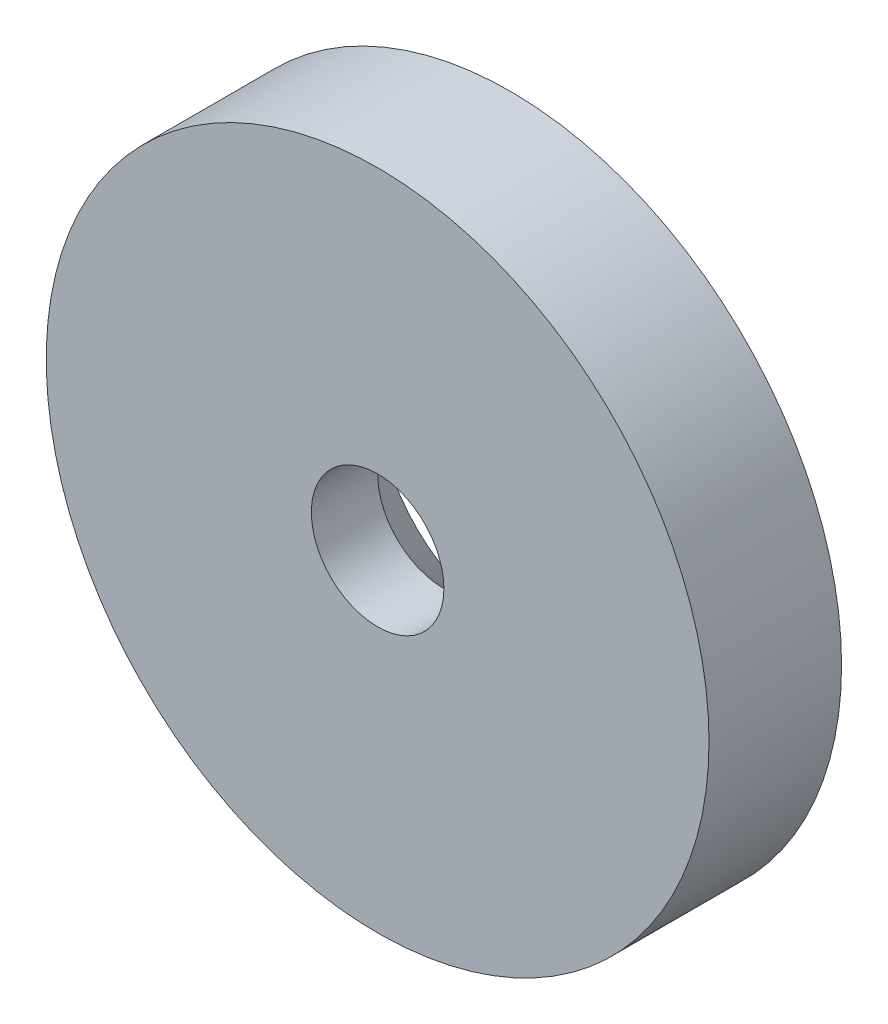
ISO-10303-21;
HEADER;
FILE_DESCRIPTION(('STEP AP214'),'2;1');
FILE_NAME('part.step','',(''),(''),'','','');
FILE_SCHEMA(('AUTOMOTIVE_DESIGN { 1 0 10303 214 1 1 1 1 }'));
ENDSEC;
DATA;
#1=APPLICATION_CONTEXT('core data for automotive mechanical design processes');
#2=APPLICATION_PROTOCOL_DEFINITION('international standard','automotive_design',2000,#1);
#3=PRODUCT_CONTEXT('',#1,'mechanical');
#4=PRODUCT('Part','Part','',(#3));
#5=PRODUCT_RELATED_PRODUCT_CATEGORY('part','',(#4));
#6=PRODUCT_DEFINITION_FORMATION('','',#4);
#7=PRODUCT_DEFINITION_CONTEXT('part definition',#1,'design');
#8=PRODUCT_DEFINITION('design','',#6,#7);
#9=PRODUCT_DEFINITION_SHAPE('','',#8);
#10=(LENGTH_UNIT() NAMED_UNIT(*) SI_UNIT(.MILLI.,.METRE.));
#11=(NAMED_UNIT(*) PLANE_ANGLE_UNIT() SI_UNIT($,.RADIAN.));
#12=(NAMED_UNIT(*) SI_UNIT($,.STERADIAN.) SOLID_ANGLE_UNIT());
#13=UNCERTAINTY_MEASURE_WITH_UNIT(LENGTH_MEASURE(1.E-05),#10,'distance_accuracy_value','');
#14=(GEOMETRIC_REPRESENTATION_CONTEXT(3) GLOBAL_UNCERTAINTY_ASSIGNED_CONTEXT((#13)) GLOBAL_UNIT_ASSIGNED_CONTEXT((#10,
#11,#12)) REPRESENTATION_CONTEXT('',''));
#15=CARTESIAN_POINT('',(0.,0.,0.));
#16=DIRECTION('',(0.,0.,1.));
#17=DIRECTION('',(1.,0.,0.));
#18=AXIS2_PLACEMENT_3D('',#15,#16,#17);
#19=CARTESIAN_POINT('',(0.,0.,4.));
#20=DIRECTION('',(0.,0.,-1.));
#21=DIRECTION('',(-1.,0.,0.));
#22=AXIS2_PLACEMENT_3D('',#19,#20,#21);
#23=CYLINDRICAL_SURFACE('',#22,10.);
#24=CARTESIAN_POINT('',(0.,0.,4.));
#25=DIRECTION('',(0.,0.,1.));
#26=DIRECTION('',(1.,0.,0.));
#27=AXIS2_PLACEMENT_3D('',#24,#25,#26);
#28=CIRCLE('',#27,10.);
#29=CARTESIAN_POINT('',(10.,0.,4.));
#30=VERTEX_POINT('',#29);
#31=EDGE_CURVE('E42',#30,#30,#28,.T.);
#32=ORIENTED_EDGE('',*,*,#31,.F.);
#33=EDGE_LOOP('',(#32));
#34=FACE_BOUND('',#33,.T.);
#35=CARTESIAN_POINT('',(0.,0.,0.));
#36=DIRECTION('',(0.,0.,1.));
#37=DIRECTION('',(1.,0.,0.));
#38=AXIS2_PLACEMENT_3D('',#35,#36,#37);
#39=CIRCLE('',#38,10.);
#40=CARTESIAN_POINT('',(10.,0.,0.));
#41=VERTEX_POINT('',#40);
#42=EDGE_CURVE('E46',#41,#41,#39,.T.);
#43=ORIENTED_EDGE('',*,*,#42,.T.);
#44=EDGE_LOOP('',(#43));
#45=FACE_BOUND('',#44,.T.);
#46=ADVANCED_FACE('F31',(#34,#45),#23,.T.);
#47=CARTESIAN_POINT('',(0.,0.,4.));
#48=DIRECTION('',(0.,0.,1.));
#49=DIRECTION('',(1.,0.,0.));
#50=AXIS2_PLACEMENT_3D('',#47,#48,#49);
#51=PLANE('',#50);
#52=CARTESIAN_POINT('',(0.,0.,4.));
#53=DIRECTION('',(0.,0.,1.));
#54=DIRECTION('',(1.,0.,0.));
#55=AXIS2_PLACEMENT_3D('',#52,#53,#54);
#56=CIRCLE('',#55,2.);
#57=CARTESIAN_POINT('',(2.,0.,4.));
#58=VERTEX_POINT('',#57);
#59=EDGE_CURVE('E50',#58,#58,#56,.T.);
#60=ORIENTED_EDGE('',*,*,#59,.F.);
#61=EDGE_LOOP('',(#60));
#62=FACE_BOUND('',#61,.T.);
#63=ORIENTED_EDGE('',*,*,#31,.T.);
#64=EDGE_LOOP('',(#63));
#65=FACE_BOUND('',#64,.T.);
#66=ADVANCED_FACE('F57',(#62,#65),#51,.T.);
#67=CARTESIAN_POINT('',(0.,0.,0.));
#68=DIRECTION('',(0.,0.,1.));
#69=DIRECTION('',(1.,0.,0.));
#70=AXIS2_PLACEMENT_3D('',#67,#68,#69);
#71=PLANE('',#70);
#72=CARTESIAN_POINT('',(0.,0.,0.));
#73=DIRECTION('',(0.,0.,1.));
#74=DIRECTION('',(1.,0.,0.));
#75=AXIS2_PLACEMENT_3D('',#72,#73,#74);
#76=CIRCLE('',#75,4.00000000000001);
#77=CARTESIAN_POINT('',(4.00000000000001,0.,0.));
#78=VERTEX_POINT('',#77);
#79=EDGE_CURVE('E38',#78,#78,#76,.T.);
#80=ORIENTED_EDGE('',*,*,#79,.T.);
#81=EDGE_LOOP('',(#80));
#82=FACE_BOUND('',#81,.T.);
#83=ORIENTED_EDGE('',*,*,#42,.F.);
#84=EDGE_LOOP('',(#83));
#85=FACE_BOUND('',#84,.T.);
#86=ADVANCED_FACE('F60',(#82,#85),#71,.F.);
#87=CARTESIAN_POINT('',(0.,0.,0.));
#88=DIRECTION('',(0.,0.,1.));
#89=DIRECTION('',(1.,0.,0.));
#90=AXIS2_PLACEMENT_3D('',#87,#88,#89);
#91=CYLINDRICAL_SURFACE('',#90,2.);
#92=CARTESIAN_POINT('',(0.,0.,2.00000000000001));
#93=DIRECTION('',(0.,0.,1.));
#94=DIRECTION('',(1.,0.,0.));
#95=AXIS2_PLACEMENT_3D('',#92,#93,#94);
#96=CIRCLE('',#95,2.);
#97=CARTESIAN_POINT('',(2.,0.,2.00000000000001));
#98=VERTEX_POINT('',#97);
#99=EDGE_CURVE('E10',#98,#98,#96,.F.);
#100=ORIENTED_EDGE('',*,*,#99,.T.);
#101=EDGE_LOOP('',(#100));
#102=FACE_BOUND('',#101,.T.);
#103=ORIENTED_EDGE('',*,*,#59,.T.);
#104=EDGE_LOOP('',(#103));
#105=FACE_BOUND('',#104,.T.);
#106=ADVANCED_FACE('F55',(#102,#105),#91,.F.);
#107=CARTESIAN_POINT('',(0.,0.,0.));
#108=DIRECTION('',(0.,0.,-1.));
#109=DIRECTION('',(-1.,0.,0.));
#110=AXIS2_PLACEMENT_3D('',#107,#108,#109);
#111=CONICAL_SURFACE('',#110,4.00000000000001,0.785398163397447);
#112=ORIENTED_EDGE('',*,*,#99,.F.);
#113=EDGE_LOOP('',(#112));
#114=FACE_BOUND('',#113,.T.);
#115=ORIENTED_EDGE('',*,*,#79,.F.);
#116=EDGE_LOOP('',(#115));
#117=FACE_BOUND('',#116,.T.);
#118=ADVANCED_FACE('F33',(#114,#117),#111,.F.);
#119=CLOSED_SHELL('',(#46,#66,#86,#106,#118));
#120=MANIFOLD_SOLID_BREP('B2',#119);
#121=ADVANCED_BREP_SHAPE_REPRESENTATION('',(#18,#120),#14);
#122=SHAPE_DEFINITION_REPRESENTATION(#9,#121);
ENDSEC;
END-ISO-10303-21;
